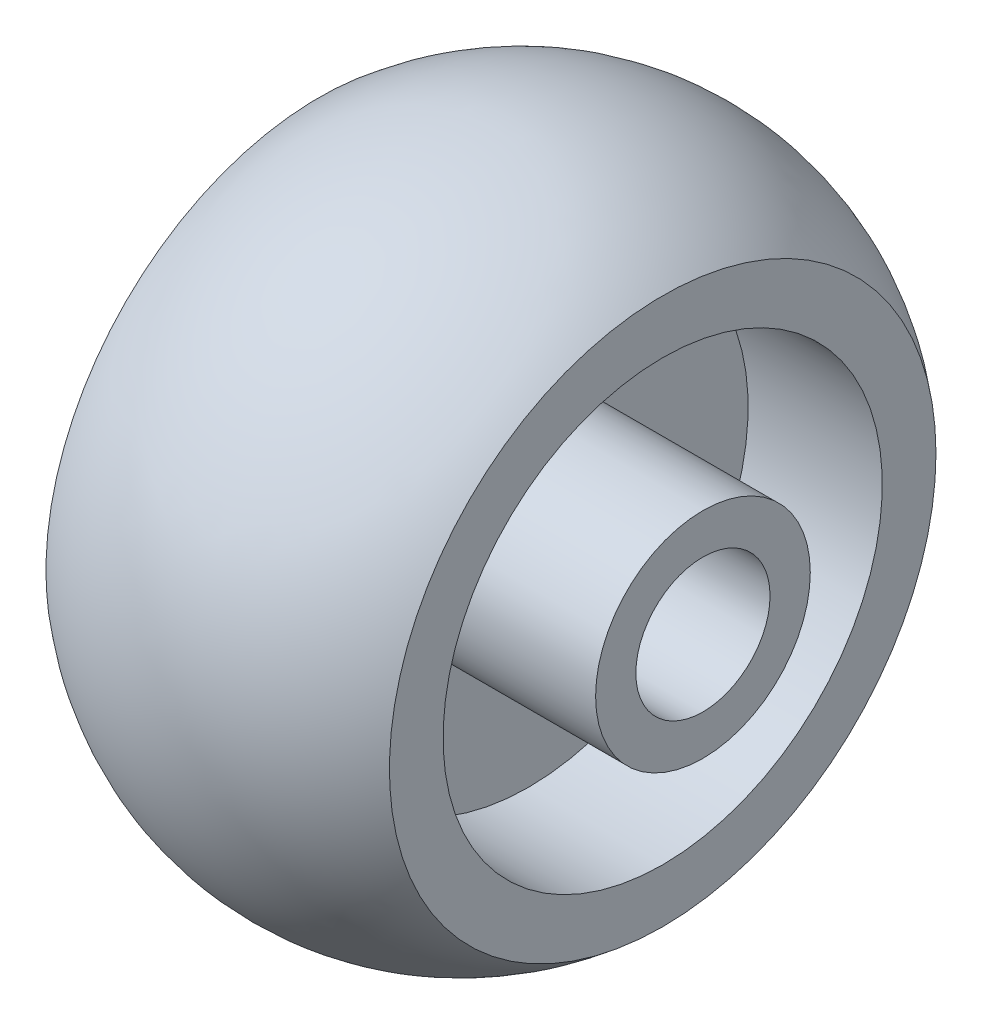
ISO-10303-21;
HEADER;
FILE_DESCRIPTION(('STEP AP214'),'2;1');
FILE_NAME('part.step','',(''),(''),'','','');
FILE_SCHEMA(('AUTOMOTIVE_DESIGN { 1 0 10303 214 1 1 1 1 }'));
ENDSEC;
DATA;
#1=APPLICATION_CONTEXT('core data for automotive mechanical design processes');
#2=APPLICATION_PROTOCOL_DEFINITION('international standard','automotive_design',2000,#1);
#3=PRODUCT_CONTEXT('',#1,'mechanical');
#4=PRODUCT('Part','Part','',(#3));
#5=PRODUCT_RELATED_PRODUCT_CATEGORY('part','',(#4));
#6=PRODUCT_DEFINITION_FORMATION('','',#4);
#7=PRODUCT_DEFINITION_CONTEXT('part definition',#1,'design');
#8=PRODUCT_DEFINITION('design','',#6,#7);
#9=PRODUCT_DEFINITION_SHAPE('','',#8);
#10=(LENGTH_UNIT() NAMED_UNIT(*) SI_UNIT(.MILLI.,.METRE.));
#11=(NAMED_UNIT(*) PLANE_ANGLE_UNIT() SI_UNIT($,.RADIAN.));
#12=(NAMED_UNIT(*) SI_UNIT($,.STERADIAN.) SOLID_ANGLE_UNIT());
#13=UNCERTAINTY_MEASURE_WITH_UNIT(LENGTH_MEASURE(1.E-05),#10,'distance_accuracy_value','');
#14=(GEOMETRIC_REPRESENTATION_CONTEXT(3) GLOBAL_UNCERTAINTY_ASSIGNED_CONTEXT((#13)) GLOBAL_UNIT_ASSIGNED_CONTEXT((#10,
#11,#12)) REPRESENTATION_CONTEXT('',''));
#15=CARTESIAN_POINT('',(0.,0.,0.));
#16=DIRECTION('',(0.,0.,1.));
#17=DIRECTION('',(1.,0.,0.));
#18=AXIS2_PLACEMENT_3D('',#15,#16,#17);
#19=CARTESIAN_POINT('',(-7.9,-2.5,0.));
#20=DIRECTION('',(-1.,0.,0.));
#21=DIRECTION('',(0.,0.,1.));
#22=AXIS2_PLACEMENT_3D('',#19,#20,#21);
#23=PLANE('',#22);
#24=CARTESIAN_POINT('',(-7.9,0.,0.));
#25=DIRECTION('',(-1.,0.,0.));
#26=DIRECTION('',(0.,0.,1.));
#27=AXIS2_PLACEMENT_3D('',#24,#25,#26);
#28=CIRCLE('',#27,2.5);
#29=CARTESIAN_POINT('',(-7.9,-2.5,0.));
#30=VERTEX_POINT('',#29);
#31=CARTESIAN_POINT('',(-7.9,2.5,0.));
#32=VERTEX_POINT('',#31);
#33=EDGE_CURVE('E205',#30,#32,#28,.T.);
#34=ORIENTED_EDGE('',*,*,#33,.F.);
#35=CARTESIAN_POINT('',(-7.9,0.,0.));
#36=DIRECTION('',(-1.,0.,0.));
#37=DIRECTION('',(0.,0.,1.));
#38=AXIS2_PLACEMENT_3D('',#35,#36,#37);
#39=CIRCLE('',#38,2.5);
#40=EDGE_CURVE('E220',#32,#30,#39,.T.);
#41=ORIENTED_EDGE('',*,*,#40,.F.);
#42=EDGE_LOOP('',(#34,#41));
#43=FACE_BOUND('',#42,.T.);
#44=CARTESIAN_POINT('',(-7.9,0.,0.));
#45=DIRECTION('',(-1.,0.,0.));
#46=DIRECTION('',(0.,0.,1.));
#47=AXIS2_PLACEMENT_3D('',#44,#45,#46);
#48=CIRCLE('',#47,4.);
#49=CARTESIAN_POINT('',(-7.9,-4.,0.));
#50=VERTEX_POINT('',#49);
#51=CARTESIAN_POINT('',(-7.9,4.,0.));
#52=VERTEX_POINT('',#51);
#53=EDGE_CURVE('E233',#50,#52,#48,.T.);
#54=ORIENTED_EDGE('',*,*,#53,.T.);
#55=CARTESIAN_POINT('',(-7.9,0.,0.));
#56=DIRECTION('',(-1.,0.,0.));
#57=DIRECTION('',(0.,0.,1.));
#58=AXIS2_PLACEMENT_3D('',#55,#56,#57);
#59=CIRCLE('',#58,4.);
#60=EDGE_CURVE('E25',#52,#50,#59,.T.);
#61=ORIENTED_EDGE('',*,*,#60,.T.);
#62=EDGE_LOOP('',(#54,#61));
#63=FACE_BOUND('',#62,.T.);
#64=ADVANCED_FACE('F16',(#43,#63),#23,.T.);
#65=CARTESIAN_POINT('',(-7.15,0.,0.));
#66=DIRECTION('',(-1.,0.,0.));
#67=DIRECTION('',(0.,-1.,0.));
#68=AXIS2_PLACEMENT_3D('',#65,#66,#67);
#69=CYLINDRICAL_SURFACE('',#68,4.);
#70=ORIENTED_EDGE('',*,*,#53,.F.);
#71=ORIENTED_EDGE('',*,*,#60,.F.);
#72=DIRECTION('',(1.,0.,0.));
#73=VECTOR('',#72,1.);
#74=CARTESIAN_POINT('',(-7.15,4.,0.));
#75=LINE('',#74,#73);
#76=CARTESIAN_POINT('',(-1.4,4.,0.));
#77=VERTEX_POINT('',#76);
#78=EDGE_CURVE('E11',#52,#77,#75,.T.);
#79=ORIENTED_EDGE('',*,*,#78,.T.);
#80=CARTESIAN_POINT('',(-1.4,0.,0.));
#81=DIRECTION('',(-1.,0.,0.));
#82=DIRECTION('',(0.,0.,1.));
#83=AXIS2_PLACEMENT_3D('',#80,#81,#82);
#84=CIRCLE('',#83,4.);
#85=CARTESIAN_POINT('',(-1.4,-4.,0.));
#86=VERTEX_POINT('',#85);
#87=EDGE_CURVE('E170',#77,#86,#84,.T.);
#88=ORIENTED_EDGE('',*,*,#87,.T.);
#89=CARTESIAN_POINT('',(-1.4,0.,0.));
#90=DIRECTION('',(-1.,0.,0.));
#91=DIRECTION('',(0.,0.,1.));
#92=AXIS2_PLACEMENT_3D('',#89,#90,#91);
#93=CIRCLE('',#92,4.);
#94=EDGE_CURVE('E140',#86,#77,#93,.T.);
#95=ORIENTED_EDGE('',*,*,#94,.T.);
#96=ORIENTED_EDGE('',*,*,#78,.F.);
#97=EDGE_LOOP('',(#70,#71,#79,#88,#95,#96));
#98=FACE_BOUND('',#97,.T.);
#99=ADVANCED_FACE('F18',(#98),#69,.T.);
#100=CARTESIAN_POINT('',(7.15,0.,0.));
#101=DIRECTION('',(-1.,0.,0.));
#102=DIRECTION('',(0.,-1.,0.));
#103=AXIS2_PLACEMENT_3D('',#100,#101,#102);
#104=CYLINDRICAL_SURFACE('',#103,4.);
#105=CARTESIAN_POINT('',(1.4,0.,0.));
#106=DIRECTION('',(-1.,0.,0.));
#107=DIRECTION('',(0.,0.,1.));
#108=AXIS2_PLACEMENT_3D('',#105,#106,#107);
#109=CIRCLE('',#108,4.);
#110=CARTESIAN_POINT('',(1.4,-4.,0.));
#111=VERTEX_POINT('',#110);
#112=CARTESIAN_POINT('',(1.4,4.,0.));
#113=VERTEX_POINT('',#112);
#114=EDGE_CURVE('E152',#111,#113,#109,.T.);
#115=ORIENTED_EDGE('',*,*,#114,.F.);
#116=CARTESIAN_POINT('',(1.4,0.,0.));
#117=DIRECTION('',(-1.,0.,0.));
#118=DIRECTION('',(0.,0.,1.));
#119=AXIS2_PLACEMENT_3D('',#116,#117,#118);
#120=CIRCLE('',#119,4.);
#121=EDGE_CURVE('E156',#113,#111,#120,.T.);
#122=ORIENTED_EDGE('',*,*,#121,.F.);
#123=DIRECTION('',(1.,0.,0.));
#124=VECTOR('',#123,1.);
#125=CARTESIAN_POINT('',(7.15,4.,0.));
#126=LINE('',#125,#124);
#127=CARTESIAN_POINT('',(7.9,4.,0.));
#128=VERTEX_POINT('',#127);
#129=EDGE_CURVE('E230',#113,#128,#126,.T.);
#130=ORIENTED_EDGE('',*,*,#129,.T.);
#131=CARTESIAN_POINT('',(7.9,0.,0.));
#132=DIRECTION('',(-1.,0.,0.));
#133=DIRECTION('',(0.,0.,1.));
#134=AXIS2_PLACEMENT_3D('',#131,#132,#133);
#135=CIRCLE('',#134,4.);
#136=CARTESIAN_POINT('',(7.9,-4.,0.));
#137=VERTEX_POINT('',#136);
#138=EDGE_CURVE('E227',#128,#137,#135,.T.);
#139=ORIENTED_EDGE('',*,*,#138,.T.);
#140=CARTESIAN_POINT('',(7.9,0.,0.));
#141=DIRECTION('',(-1.,0.,0.));
#142=DIRECTION('',(0.,0.,1.));
#143=AXIS2_PLACEMENT_3D('',#140,#141,#142);
#144=CIRCLE('',#143,4.);
#145=EDGE_CURVE('E223',#137,#128,#144,.T.);
#146=ORIENTED_EDGE('',*,*,#145,.T.);
#147=ORIENTED_EDGE('',*,*,#129,.F.);
#148=EDGE_LOOP('',(#115,#122,#130,#139,#146,#147));
#149=FACE_BOUND('',#148,.T.);
#150=ADVANCED_FACE('F364',(#149),#104,.T.);
#151=CARTESIAN_POINT('',(7.9,-4.,0.));
#152=DIRECTION('',(1.,0.,0.));
#153=DIRECTION('',(0.,1.,0.));
#154=AXIS2_PLACEMENT_3D('',#151,#152,#153);
#155=PLANE('',#154);
#156=CARTESIAN_POINT('',(7.9,0.,0.));
#157=DIRECTION('',(-1.,0.,0.));
#158=DIRECTION('',(0.,0.,1.));
#159=AXIS2_PLACEMENT_3D('',#156,#157,#158);
#160=CIRCLE('',#159,2.5);
#161=CARTESIAN_POINT('',(7.9,-2.5,0.));
#162=VERTEX_POINT('',#161);
#163=CARTESIAN_POINT('',(7.9,2.5,0.));
#164=VERTEX_POINT('',#163);
#165=EDGE_CURVE('E210',#162,#164,#160,.T.);
#166=ORIENTED_EDGE('',*,*,#165,.T.);
#167=CARTESIAN_POINT('',(7.9,0.,0.));
#168=DIRECTION('',(-1.,0.,0.));
#169=DIRECTION('',(0.,0.,1.));
#170=AXIS2_PLACEMENT_3D('',#167,#168,#169);
#171=CIRCLE('',#170,2.5);
#172=EDGE_CURVE('E217',#164,#162,#171,.T.);
#173=ORIENTED_EDGE('',*,*,#172,.T.);
#174=EDGE_LOOP('',(#166,#173));
#175=FACE_BOUND('',#174,.T.);
#176=ORIENTED_EDGE('',*,*,#145,.F.);
#177=ORIENTED_EDGE('',*,*,#138,.F.);
#178=EDGE_LOOP('',(#176,#177));
#179=FACE_BOUND('',#178,.T.);
#180=ADVANCED_FACE('F371',(#175,#179),#155,.T.);
#181=CARTESIAN_POINT('',(7.15,0.,0.));
#182=DIRECTION('',(-1.,0.,0.));
#183=DIRECTION('',(0.,-1.,0.));
#184=AXIS2_PLACEMENT_3D('',#181,#182,#183);
#185=CYLINDRICAL_SURFACE('',#184,2.5);
#186=ORIENTED_EDGE('',*,*,#33,.T.);
#187=DIRECTION('',(1.,0.,0.));
#188=VECTOR('',#187,1.);
#189=CARTESIAN_POINT('',(7.15,2.5,0.));
#190=LINE('',#189,#188);
#191=EDGE_CURVE('E206',#32,#164,#190,.T.);
#192=ORIENTED_EDGE('',*,*,#191,.T.);
#193=ORIENTED_EDGE('',*,*,#165,.F.);
#194=ORIENTED_EDGE('',*,*,#172,.F.);
#195=ORIENTED_EDGE('',*,*,#191,.F.);
#196=ORIENTED_EDGE('',*,*,#40,.T.);
#197=EDGE_LOOP('',(#186,#192,#193,#194,#195,#196));
#198=FACE_BOUND('',#197,.T.);
#199=ADVANCED_FACE('F374',(#198),#185,.F.);
#200=CARTESIAN_POINT('',(6.4,0.,-10.1837490849194));
#201=CARTESIAN_POINT('',(6.4,-10.1837490849194,-10.1837490849194));
#202=CARTESIAN_POINT('',(6.4,-10.1837490849194,0.));
#203=CARTESIAN_POINT('',(6.4,-10.1837490849194,10.1837490849194));
#204=CARTESIAN_POINT('',(6.4,0.,10.1837490849194));
#205=CARTESIAN_POINT('',(6.4,10.1837490849194,10.1837490849194));
#206=CARTESIAN_POINT('',(6.4,10.1837490849194,0.));
#207=CARTESIAN_POINT('',(6.4,10.1837490849194,-10.1837490849194));
#208=CARTESIAN_POINT('',(6.4,0.,-10.1837490849194));
#209=CARTESIAN_POINT('',(0.,0.,-15.5144801573838));
#210=CARTESIAN_POINT('',(0.,-15.5144801573838,-15.5144801573838));
#211=CARTESIAN_POINT('',(0.,-15.5144801573838,0.));
#212=CARTESIAN_POINT('',(0.,-15.5144801573838,15.5144801573838));
#213=CARTESIAN_POINT('',(0.,0.,15.5144801573838));
#214=CARTESIAN_POINT('',(0.,15.5144801573838,15.5144801573838));
#215=CARTESIAN_POINT('',(0.,15.5144801573838,0.));
#216=CARTESIAN_POINT('',(0.,15.5144801573838,-15.5144801573838));
#217=CARTESIAN_POINT('',(0.,0.,-15.5144801573838));
#218=CARTESIAN_POINT('',(-6.4,0.,-10.1837490849194));
#219=CARTESIAN_POINT('',(-6.4,-10.1837490849194,-10.1837490849194));
#220=CARTESIAN_POINT('',(-6.4,-10.1837490849194,0.));
#221=CARTESIAN_POINT('',(-6.4,-10.1837490849194,10.1837490849194));
#222=CARTESIAN_POINT('',(-6.4,0.,10.1837490849194));
#223=CARTESIAN_POINT('',(-6.4,10.1837490849194,10.1837490849194));
#224=CARTESIAN_POINT('',(-6.4,10.1837490849194,0.));
#225=CARTESIAN_POINT('',(-6.4,10.1837490849194,-10.1837490849194));
#226=CARTESIAN_POINT('',(-6.4,0.,-10.1837490849194));
#227=(BOUNDED_SURFACE() B_SPLINE_SURFACE(2,2,((#200,#201,#202,#203,#204,#205,#206,#207,#208),
(#209,#210,#211,#212,#213,#214,#215,#216,#217),(#218,#219,#220,#221,#222,#223,#224,#225,#226)),
.UNSPECIFIED.,.F.,.T.,.F.) B_SPLINE_SURFACE_WITH_KNOTS((3,3),(3,2,2,2,3),(-0.694498265626556,
0.694498265626556),(-3.14159265358979,-1.5707963267949,0.,1.5707963267949,3.14159265358979),
.UNSPECIFIED.) GEOMETRIC_REPRESENTATION_ITEM() RATIONAL_B_SPLINE_SURFACE(((1.,0.707106781186548,
1.,0.707106781186548,1.,0.707106781186548,1.,0.707106781186548,1.),(0.768374908491942,
0.543323108288245,0.768374908491942,0.543323108288245,0.768374908491942,0.543323108288245,
0.768374908491942,0.543323108288245,0.768374908491942),(1.,0.707106781186548,1.,
0.707106781186548,1.,0.707106781186548,1.,0.707106781186548,1.))) REPRESENTATION_ITEM('') SURFACE());
#228=CARTESIAN_POINT('',(-6.4,0.,0.));
#229=DIRECTION('',(-1.,0.,0.));
#230=DIRECTION('',(0.,0.,1.));
#231=AXIS2_PLACEMENT_3D('',#228,#229,#230);
#232=CIRCLE('',#231,10.1837490849194);
#233=CARTESIAN_POINT('',(-6.4,-10.1837490849194,0.));
#234=VERTEX_POINT('',#233);
#235=CARTESIAN_POINT('',(-6.4,0.,-10.1837490849194));
#236=VERTEX_POINT('',#235);
#237=EDGE_CURVE('E189',#234,#236,#232,.T.);
#238=CARTESIAN_POINT('',(-6.4,0.,0.));
#239=DIRECTION('',(-1.,0.,0.));
#240=DIRECTION('',(0.,0.,1.));
#241=AXIS2_PLACEMENT_3D('',#238,#239,#240);
#242=CIRCLE('',#241,10.1837490849194);
#243=EDGE_CURVE('E176',#236,#234,#242,.T.);
#244=CARTESIAN_POINT('',(0.,0.,-2.5));
#245=DIRECTION('',(0.,-1.,0.));
#246=DIRECTION('',(0.,0.,-1.));
#247=AXIS2_PLACEMENT_3D('',#244,#245,#246);
#248=CIRCLE('',#247,10.);
#249=CARTESIAN_POINT('',(6.4,0.,-10.1837490849194));
#250=VERTEX_POINT('',#249);
#251=EDGE_CURVE('E202',#236,#250,#248,.T.);
#252=CARTESIAN_POINT('',(6.4,0.,0.));
#253=DIRECTION('',(-1.,0.,0.));
#254=DIRECTION('',(0.,0.,1.));
#255=AXIS2_PLACEMENT_3D('',#252,#253,#254);
#256=CIRCLE('',#255,10.1837490849194);
#257=CARTESIAN_POINT('',(6.4,-10.1837490849194,0.));
#258=VERTEX_POINT('',#257);
#259=EDGE_CURVE('E175',#250,#258,#256,.T.);
#260=CARTESIAN_POINT('',(6.4,0.,0.));
#261=DIRECTION('',(-1.,0.,0.));
#262=DIRECTION('',(0.,0.,1.));
#263=AXIS2_PLACEMENT_3D('',#260,#261,#262);
#264=CIRCLE('',#263,10.1837490849194);
#265=EDGE_CURVE('E171',#258,#250,#264,.T.);
#266=ORIENTED_EDGE('',*,*,#237,.F.);
#267=ORIENTED_EDGE('',*,*,#243,.F.);
#268=ORIENTED_EDGE('',*,*,#251,.T.);
#269=ORIENTED_EDGE('',*,*,#259,.T.);
#270=ORIENTED_EDGE('',*,*,#265,.T.);
#271=ORIENTED_EDGE('',*,*,#251,.F.);
#272=EDGE_LOOP('',(#266,#267,#268,#269,#270,#271));
#273=FACE_BOUND('',#272,.T.);
#274=ADVANCED_FACE('F340',(#273),#227,.F.);
#275=CARTESIAN_POINT('',(6.4,-10.1837490849194,0.));
#276=DIRECTION('',(1.,0.,0.));
#277=DIRECTION('',(0.,1.,0.));
#278=AXIS2_PLACEMENT_3D('',#275,#276,#277);
#279=PLANE('',#278);
#280=CARTESIAN_POINT('',(6.4,0.,0.));
#281=DIRECTION('',(-1.,0.,0.));
#282=DIRECTION('',(0.,-1.,0.));
#283=AXIS2_PLACEMENT_3D('',#280,#281,#282);
#284=CIRCLE('',#283,8.18374908491941);
#285=CARTESIAN_POINT('',(6.4,-8.18374908491941,0.));
#286=VERTEX_POINT('',#285);
#287=CARTESIAN_POINT('',(6.4,8.18374908491941,0.));
#288=VERTEX_POINT('',#287);
#289=EDGE_CURVE('E157',#286,#288,#284,.T.);
#290=ORIENTED_EDGE('',*,*,#289,.T.);
#291=CARTESIAN_POINT('',(6.4,0.,0.));
#292=DIRECTION('',(-1.,0.,0.));
#293=DIRECTION('',(0.,-1.,0.));
#294=AXIS2_PLACEMENT_3D('',#291,#292,#293);
#295=CIRCLE('',#294,8.18374908491941);
#296=EDGE_CURVE('E160',#288,#286,#295,.T.);
#297=ORIENTED_EDGE('',*,*,#296,.T.);
#298=EDGE_LOOP('',(#290,#297));
#299=FACE_BOUND('',#298,.T.);
#300=ORIENTED_EDGE('',*,*,#265,.F.);
#301=ORIENTED_EDGE('',*,*,#259,.F.);
#302=EDGE_LOOP('',(#300,#301));
#303=FACE_BOUND('',#302,.T.);
#304=ADVANCED_FACE('F336',(#299,#303),#279,.T.);
#305=CARTESIAN_POINT('',(-6.4,0.,0.));
#306=DIRECTION('',(-1.,0.,0.));
#307=DIRECTION('',(0.,0.,1.));
#308=AXIS2_PLACEMENT_3D('',#305,#306,#307);
#309=PLANE('',#308);
#310=CARTESIAN_POINT('',(-6.4,0.,0.));
#311=DIRECTION('',(1.,0.,0.));
#312=DIRECTION('',(0.,-1.,0.));
#313=AXIS2_PLACEMENT_3D('',#310,#311,#312);
#314=CIRCLE('',#313,8.18374908491941);
#315=CARTESIAN_POINT('',(-6.4,-8.18374908491941,0.));
#316=VERTEX_POINT('',#315);
#317=CARTESIAN_POINT('',(-6.4,8.18374908491941,0.));
#318=VERTEX_POINT('',#317);
#319=EDGE_CURVE('E186',#316,#318,#314,.T.);
#320=ORIENTED_EDGE('',*,*,#319,.T.);
#321=CARTESIAN_POINT('',(-6.4,0.,0.));
#322=DIRECTION('',(1.,0.,0.));
#323=DIRECTION('',(0.,-1.,0.));
#324=AXIS2_PLACEMENT_3D('',#321,#322,#323);
#325=CIRCLE('',#324,8.18374908491941);
#326=EDGE_CURVE('E161',#318,#316,#325,.T.);
#327=ORIENTED_EDGE('',*,*,#326,.T.);
#328=EDGE_LOOP('',(#320,#327));
#329=FACE_BOUND('',#328,.T.);
#330=ORIENTED_EDGE('',*,*,#237,.T.);
#331=ORIENTED_EDGE('',*,*,#243,.T.);
#332=EDGE_LOOP('',(#330,#331));
#333=FACE_BOUND('',#332,.T.);
#334=ADVANCED_FACE('F339',(#329,#333),#309,.T.);
#335=CARTESIAN_POINT('',(1.4,-4.,0.));
#336=DIRECTION('',(-1.,0.,0.));
#337=DIRECTION('',(0.,0.,1.));
#338=AXIS2_PLACEMENT_3D('',#335,#336,#337);
#339=PLANE('',#338);
#340=ORIENTED_EDGE('',*,*,#114,.T.);
#341=ORIENTED_EDGE('',*,*,#121,.T.);
#342=EDGE_LOOP('',(#340,#341));
#343=FACE_BOUND('',#342,.T.);
#344=CARTESIAN_POINT('',(1.4,0.,0.));
#345=DIRECTION('',(-1.,0.,0.));
#346=DIRECTION('',(0.,0.,1.));
#347=AXIS2_PLACEMENT_3D('',#344,#345,#346);
#348=CIRCLE('',#347,8.18374908491941);
#349=CARTESIAN_POINT('',(1.4,-8.18374908491941,0.));
#350=VERTEX_POINT('',#349);
#351=CARTESIAN_POINT('',(1.4,8.18374908491941,0.));
#352=VERTEX_POINT('',#351);
#353=EDGE_CURVE('E151',#350,#352,#348,.T.);
#354=ORIENTED_EDGE('',*,*,#353,.F.);
#355=CARTESIAN_POINT('',(1.4,0.,0.));
#356=DIRECTION('',(-1.,0.,0.));
#357=DIRECTION('',(0.,0.,1.));
#358=AXIS2_PLACEMENT_3D('',#355,#356,#357);
#359=CIRCLE('',#358,8.18374908491941);
#360=EDGE_CURVE('E167',#352,#350,#359,.T.);
#361=ORIENTED_EDGE('',*,*,#360,.F.);
#362=EDGE_LOOP('',(#354,#361));
#363=FACE_BOUND('',#362,.T.);
#364=ADVANCED_FACE('F334',(#343,#363),#339,.F.);
#365=CARTESIAN_POINT('',(3.9,0.,0.));
#366=DIRECTION('',(-1.,0.,0.));
#367=DIRECTION('',(0.,-1.,0.));
#368=AXIS2_PLACEMENT_3D('',#365,#366,#367);
#369=CYLINDRICAL_SURFACE('',#368,8.18374908491941);
#370=ORIENTED_EDGE('',*,*,#289,.F.);
#371=ORIENTED_EDGE('',*,*,#296,.F.);
#372=DIRECTION('',(-1.,0.,0.));
#373=VECTOR('',#372,1.);
#374=CARTESIAN_POINT('',(3.9,8.18374908491941,0.));
#375=LINE('',#374,#373);
#376=EDGE_CURVE('E163',#288,#352,#375,.T.);
#377=ORIENTED_EDGE('',*,*,#376,.T.);
#378=ORIENTED_EDGE('',*,*,#360,.T.);
#379=ORIENTED_EDGE('',*,*,#353,.T.);
#380=ORIENTED_EDGE('',*,*,#376,.F.);
#381=EDGE_LOOP('',(#370,#371,#377,#378,#379,#380));
#382=FACE_BOUND('',#381,.T.);
#383=ADVANCED_FACE('F331',(#382),#369,.F.);
#384=CARTESIAN_POINT('',(-3.9,0.,0.));
#385=DIRECTION('',(-1.,0.,0.));
#386=DIRECTION('',(0.,-1.,0.));
#387=AXIS2_PLACEMENT_3D('',#384,#385,#386);
#388=CYLINDRICAL_SURFACE('',#387,8.18374908491941);
#389=CARTESIAN_POINT('',(-1.4,0.,0.));
#390=DIRECTION('',(-1.,0.,0.));
#391=DIRECTION('',(0.,0.,1.));
#392=AXIS2_PLACEMENT_3D('',#389,#390,#391);
#393=CIRCLE('',#392,8.18374908491941);
#394=CARTESIAN_POINT('',(-1.4,-8.18374908491941,0.));
#395=VERTEX_POINT('',#394);
#396=CARTESIAN_POINT('',(-1.4,8.18374908491941,0.));
#397=VERTEX_POINT('',#396);
#398=EDGE_CURVE('E136',#395,#397,#393,.T.);
#399=ORIENTED_EDGE('',*,*,#398,.F.);
#400=CARTESIAN_POINT('',(-1.4,0.,0.));
#401=DIRECTION('',(-1.,0.,0.));
#402=DIRECTION('',(0.,0.,1.));
#403=AXIS2_PLACEMENT_3D('',#400,#401,#402);
#404=CIRCLE('',#403,8.18374908491941);
#405=EDGE_CURVE('E133',#397,#395,#404,.T.);
#406=ORIENTED_EDGE('',*,*,#405,.F.);
#407=DIRECTION('',(-1.,0.,0.));
#408=VECTOR('',#407,1.);
#409=CARTESIAN_POINT('',(-3.9,8.18374908491941,0.));
#410=LINE('',#409,#408);
#411=EDGE_CURVE('E143',#397,#318,#410,.T.);
#412=ORIENTED_EDGE('',*,*,#411,.T.);
#413=ORIENTED_EDGE('',*,*,#319,.F.);
#414=ORIENTED_EDGE('',*,*,#326,.F.);
#415=ORIENTED_EDGE('',*,*,#411,.F.);
#416=EDGE_LOOP('',(#399,#406,#412,#413,#414,#415));
#417=FACE_BOUND('',#416,.T.);
#418=ADVANCED_FACE('F142',(#417),#388,.F.);
#419=CARTESIAN_POINT('',(-1.4,-8.18374908491941,0.));
#420=DIRECTION('',(1.,0.,0.));
#421=DIRECTION('',(0.,1.,0.));
#422=AXIS2_PLACEMENT_3D('',#419,#420,#421);
#423=PLANE('',#422);
#424=ORIENTED_EDGE('',*,*,#94,.F.);
#425=ORIENTED_EDGE('',*,*,#87,.F.);
#426=EDGE_LOOP('',(#424,#425));
#427=FACE_BOUND('',#426,.T.);
#428=ORIENTED_EDGE('',*,*,#398,.T.);
#429=ORIENTED_EDGE('',*,*,#405,.T.);
#430=EDGE_LOOP('',(#428,#429));
#431=FACE_BOUND('',#430,.T.);
#432=ADVANCED_FACE('F135',(#427,#431),#423,.F.);
#433=CLOSED_SHELL('',(#64,#99,#150,#180,#199,#274,#304,#334,#364,#383,#418,#432));
#434=MANIFOLD_SOLID_BREP('B1',#433);
#435=ADVANCED_BREP_SHAPE_REPRESENTATION('',(#18,#434),#14);
#436=SHAPE_DEFINITION_REPRESENTATION(#9,#435);
ENDSEC;
END-ISO-10303-21;
